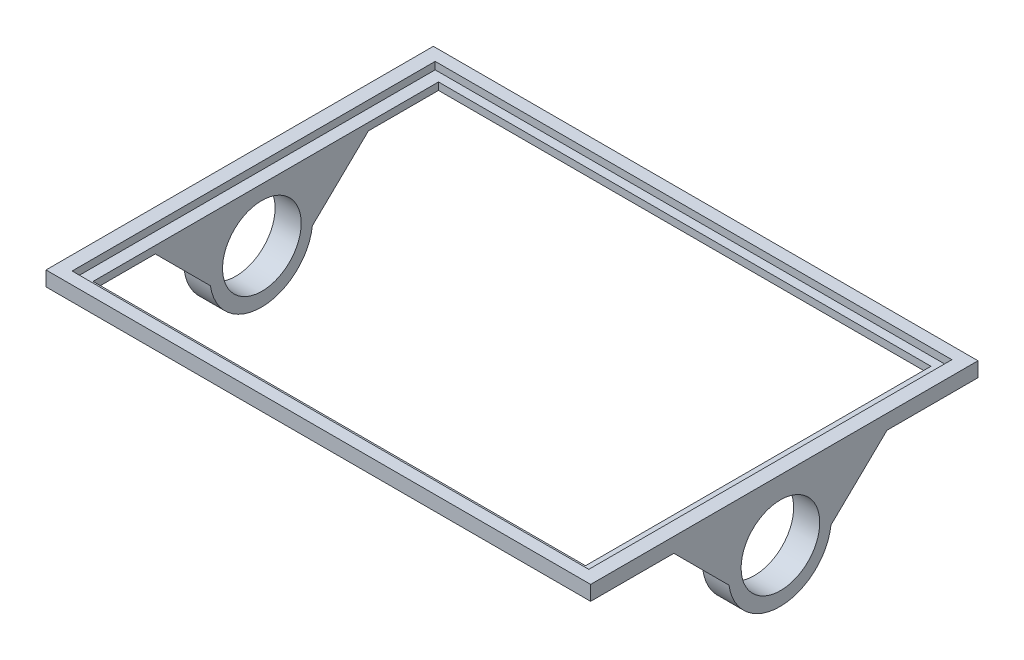
ISO-10303-21;
HEADER;
FILE_DESCRIPTION(('STEP AP214'),'2;1');
FILE_NAME('part.step','',(''),(''),'','','');
FILE_SCHEMA(('AUTOMOTIVE_DESIGN { 1 0 10303 214 1 1 1 1 }'));
ENDSEC;
DATA;
#1=APPLICATION_CONTEXT('core data for automotive mechanical design processes');
#2=APPLICATION_PROTOCOL_DEFINITION('international standard','automotive_design',2000,#1);
#3=PRODUCT_CONTEXT('',#1,'mechanical');
#4=PRODUCT('Part','Part','',(#3));
#5=PRODUCT_RELATED_PRODUCT_CATEGORY('part','',(#4));
#6=PRODUCT_DEFINITION_FORMATION('','',#4);
#7=PRODUCT_DEFINITION_CONTEXT('part definition',#1,'design');
#8=PRODUCT_DEFINITION('design','',#6,#7);
#9=PRODUCT_DEFINITION_SHAPE('','',#8);
#10=(LENGTH_UNIT() NAMED_UNIT(*) SI_UNIT(.MILLI.,.METRE.));
#11=(NAMED_UNIT(*) PLANE_ANGLE_UNIT() SI_UNIT($,.RADIAN.));
#12=(NAMED_UNIT(*) SI_UNIT($,.STERADIAN.) SOLID_ANGLE_UNIT());
#13=UNCERTAINTY_MEASURE_WITH_UNIT(LENGTH_MEASURE(1.E-05),#10,'distance_accuracy_value','');
#14=(GEOMETRIC_REPRESENTATION_CONTEXT(3) GLOBAL_UNCERTAINTY_ASSIGNED_CONTEXT((#13)) GLOBAL_UNIT_ASSIGNED_CONTEXT((#10,
#11,#12)) REPRESENTATION_CONTEXT('',''));
#15=CARTESIAN_POINT('',(0.,0.,0.));
#16=DIRECTION('',(0.,0.,1.));
#17=DIRECTION('',(1.,0.,0.));
#18=AXIS2_PLACEMENT_3D('',#15,#16,#17);
#19=CARTESIAN_POINT('',(0.,0.,0.));
#20=DIRECTION('',(0.,-1.,0.));
#21=DIRECTION('',(0.,0.,-1.));
#22=AXIS2_PLACEMENT_3D('',#19,#20,#21);
#23=PLANE('',#22);
#24=DIRECTION('',(1.,0.,0.));
#25=VECTOR('',#24,1.);
#26=CARTESIAN_POINT('',(0.,0.,23.5));
#27=LINE('',#26,#25);
#28=CARTESIAN_POINT('',(-33.5,0.,23.5));
#29=VERTEX_POINT('',#28);
#30=CARTESIAN_POINT('',(33.5,0.,23.5));
#31=VERTEX_POINT('',#30);
#32=EDGE_CURVE('E235',#29,#31,#27,.T.);
#33=ORIENTED_EDGE('',*,*,#32,.T.);
#34=DIRECTION('',(0.,0.,-1.));
#35=VECTOR('',#34,1.);
#36=CARTESIAN_POINT('',(33.5,0.,0.));
#37=LINE('',#36,#35);
#38=CARTESIAN_POINT('',(33.5,0.,15.0309445711443));
#39=VERTEX_POINT('',#38);
#40=EDGE_CURVE('E228',#31,#39,#37,.T.);
#41=ORIENTED_EDGE('',*,*,#40,.T.);
#42=DIRECTION('',(1.,0.,0.));
#43=VECTOR('',#42,1.);
#44=CARTESIAN_POINT('',(-37.05,0.,15.0309445711443));
#45=LINE('',#44,#43);
#46=CARTESIAN_POINT('',(37.05,0.,15.0309445711443));
#47=VERTEX_POINT('',#46);
#48=EDGE_CURVE('E282',#39,#47,#45,.T.);
#49=ORIENTED_EDGE('',*,*,#48,.T.);
#50=DIRECTION('',(0.,0.,-1.));
#51=VECTOR('',#50,1.);
#52=CARTESIAN_POINT('',(37.05,0.,26.35));
#53=LINE('',#52,#51);
#54=CARTESIAN_POINT('',(37.05,0.,26.35));
#55=VERTEX_POINT('',#54);
#56=EDGE_CURVE('E352',#55,#47,#53,.T.);
#57=ORIENTED_EDGE('',*,*,#56,.F.);
#58=DIRECTION('',(1.,0.,0.));
#59=VECTOR('',#58,1.);
#60=CARTESIAN_POINT('',(-37.05,0.,26.35));
#61=LINE('',#60,#59);
#62=CARTESIAN_POINT('',(-37.05,0.,26.35));
#63=VERTEX_POINT('',#62);
#64=EDGE_CURVE('E342',#63,#55,#61,.T.);
#65=ORIENTED_EDGE('',*,*,#64,.F.);
#66=DIRECTION('',(0.,0.,1.));
#67=VECTOR('',#66,1.);
#68=CARTESIAN_POINT('',(-37.05,0.,26.35));
#69=LINE('',#68,#67);
#70=CARTESIAN_POINT('',(-37.05,0.,15.0309445711443));
#71=VERTEX_POINT('',#70);
#72=EDGE_CURVE('E359',#71,#63,#69,.T.);
#73=ORIENTED_EDGE('',*,*,#72,.F.);
#74=CARTESIAN_POINT('',(-33.5,0.,15.0309445711443));
#75=VERTEX_POINT('',#74);
#76=EDGE_CURVE('E283',#71,#75,#45,.T.);
#77=ORIENTED_EDGE('',*,*,#76,.T.);
#78=DIRECTION('',(0.,0.,1.));
#79=VECTOR('',#78,1.);
#80=CARTESIAN_POINT('',(-33.5,0.,0.));
#81=LINE('',#80,#79);
#82=EDGE_CURVE('E202',#75,#29,#81,.T.);
#83=ORIENTED_EDGE('',*,*,#82,.T.);
#84=EDGE_LOOP('',(#33,#41,#49,#57,#65,#73,#77,#83));
#85=FACE_BOUND('',#84,.T.);
#86=ADVANCED_FACE('F45',(#85),#23,.T.);
#87=DIRECTION('',(1.,0.,0.));
#88=VECTOR('',#87,1.);
#89=CARTESIAN_POINT('',(-37.05,0.,-13.9690554288554));
#90=LINE('',#89,#88);
#91=CARTESIAN_POINT('',(33.5,0.,-13.9690554288554));
#92=VERTEX_POINT('',#91);
#93=CARTESIAN_POINT('',(37.05,0.,-13.9690554288554));
#94=VERTEX_POINT('',#93);
#95=EDGE_CURVE('E277',#92,#94,#90,.T.);
#96=ORIENTED_EDGE('',*,*,#95,.F.);
#97=DIRECTION('',(0.,0.,-1.));
#98=VECTOR('',#97,1.);
#99=CARTESIAN_POINT('',(33.5,0.,0.));
#100=LINE('',#99,#98);
#101=CARTESIAN_POINT('',(33.5,0.,-23.5));
#102=VERTEX_POINT('',#101);
#103=EDGE_CURVE('E220',#92,#102,#100,.T.);
#104=ORIENTED_EDGE('',*,*,#103,.T.);
#105=DIRECTION('',(-1.,0.,0.));
#106=VECTOR('',#105,1.);
#107=CARTESIAN_POINT('',(0.,0.,-23.5));
#108=LINE('',#107,#106);
#109=CARTESIAN_POINT('',(-33.5,0.,-23.5));
#110=VERTEX_POINT('',#109);
#111=EDGE_CURVE('E239',#102,#110,#108,.T.);
#112=ORIENTED_EDGE('',*,*,#111,.T.);
#113=DIRECTION('',(0.,0.,1.));
#114=VECTOR('',#113,1.);
#115=CARTESIAN_POINT('',(-33.5,0.,0.));
#116=LINE('',#115,#114);
#117=CARTESIAN_POINT('',(-33.5,0.,-13.9690554288554));
#118=VERTEX_POINT('',#117);
#119=EDGE_CURVE('E196',#110,#118,#116,.T.);
#120=ORIENTED_EDGE('',*,*,#119,.T.);
#121=CARTESIAN_POINT('',(-37.05,0.,-13.9690554288554));
#122=VERTEX_POINT('',#121);
#123=EDGE_CURVE('E278',#122,#118,#90,.T.);
#124=ORIENTED_EDGE('',*,*,#123,.F.);
#125=CARTESIAN_POINT('',(-37.05,0.,-26.35));
#126=VERTEX_POINT('',#125);
#127=EDGE_CURVE('E360',#126,#122,#69,.T.);
#128=ORIENTED_EDGE('',*,*,#127,.F.);
#129=DIRECTION('',(-1.,0.,0.));
#130=VECTOR('',#129,1.);
#131=CARTESIAN_POINT('',(-37.05,0.,-26.35));
#132=LINE('',#131,#130);
#133=CARTESIAN_POINT('',(37.05,0.,-26.35));
#134=VERTEX_POINT('',#133);
#135=EDGE_CURVE('E356',#134,#126,#132,.T.);
#136=ORIENTED_EDGE('',*,*,#135,.F.);
#137=EDGE_CURVE('E327',#94,#134,#53,.T.);
#138=ORIENTED_EDGE('',*,*,#137,.F.);
#139=EDGE_LOOP('',(#96,#104,#112,#120,#124,#128,#136,#138));
#140=FACE_BOUND('',#139,.T.);
#141=ADVANCED_FACE('F406',(#140),#23,.T.);
#142=CARTESIAN_POINT('',(0.,1.,0.));
#143=DIRECTION('',(0.,1.,0.));
#144=DIRECTION('',(0.,0.,1.));
#145=AXIS2_PLACEMENT_3D('',#142,#143,#144);
#146=PLANE('',#145);
#147=DIRECTION('',(1.,0.,0.));
#148=VECTOR('',#147,1.);
#149=CARTESIAN_POINT('',(0.,1.,24.7));
#150=LINE('',#149,#148);
#151=CARTESIAN_POINT('',(-35.15,1.,24.7));
#152=VERTEX_POINT('',#151);
#153=CARTESIAN_POINT('',(35.15,1.,24.7));
#154=VERTEX_POINT('',#153);
#155=EDGE_CURVE('E293',#152,#154,#150,.T.);
#156=ORIENTED_EDGE('',*,*,#155,.T.);
#157=DIRECTION('',(0.,0.,-1.));
#158=VECTOR('',#157,1.);
#159=CARTESIAN_POINT('',(35.15,1.,0.));
#160=LINE('',#159,#158);
#161=CARTESIAN_POINT('',(35.15,1.,-24.7));
#162=VERTEX_POINT('',#161);
#163=EDGE_CURVE('E297',#154,#162,#160,.T.);
#164=ORIENTED_EDGE('',*,*,#163,.T.);
#165=DIRECTION('',(-1.,0.,0.));
#166=VECTOR('',#165,1.);
#167=CARTESIAN_POINT('',(0.,1.,-24.7));
#168=LINE('',#167,#166);
#169=CARTESIAN_POINT('',(-35.15,1.,-24.7));
#170=VERTEX_POINT('',#169);
#171=EDGE_CURVE('E302',#162,#170,#168,.T.);
#172=ORIENTED_EDGE('',*,*,#171,.T.);
#173=DIRECTION('',(0.,0.,1.));
#174=VECTOR('',#173,1.);
#175=CARTESIAN_POINT('',(-35.15,1.,0.));
#176=LINE('',#175,#174);
#177=EDGE_CURVE('E306',#170,#152,#176,.T.);
#178=ORIENTED_EDGE('',*,*,#177,.T.);
#179=EDGE_LOOP('',(#156,#164,#172,#178));
#180=FACE_BOUND('',#179,.T.);
#181=DIRECTION('',(1.,0.,0.));
#182=VECTOR('',#181,1.);
#183=CARTESIAN_POINT('',(0.,1.,-23.5));
#184=LINE('',#183,#182);
#185=CARTESIAN_POINT('',(-33.5,1.,-23.5));
#186=VERTEX_POINT('',#185);
#187=CARTESIAN_POINT('',(33.5,1.,-23.5));
#188=VERTEX_POINT('',#187);
#189=EDGE_CURVE('E11',#186,#188,#184,.T.);
#190=ORIENTED_EDGE('',*,*,#189,.T.);
#191=DIRECTION('',(0.,0.,1.));
#192=VECTOR('',#191,1.);
#193=CARTESIAN_POINT('',(33.5,1.,0.));
#194=LINE('',#193,#192);
#195=CARTESIAN_POINT('',(33.5,1.,23.5));
#196=VERTEX_POINT('',#195);
#197=EDGE_CURVE('E232',#188,#196,#194,.T.);
#198=ORIENTED_EDGE('',*,*,#197,.T.);
#199=DIRECTION('',(-1.,0.,0.));
#200=VECTOR('',#199,1.);
#201=CARTESIAN_POINT('',(0.,1.,23.5));
#202=LINE('',#201,#200);
#203=CARTESIAN_POINT('',(-33.5,1.,23.5));
#204=VERTEX_POINT('',#203);
#205=EDGE_CURVE('E54',#196,#204,#202,.T.);
#206=ORIENTED_EDGE('',*,*,#205,.T.);
#207=DIRECTION('',(0.,0.,-1.));
#208=VECTOR('',#207,1.);
#209=CARTESIAN_POINT('',(-33.5,1.,0.));
#210=LINE('',#209,#208);
#211=EDGE_CURVE('E193',#204,#186,#210,.T.);
#212=ORIENTED_EDGE('',*,*,#211,.T.);
#213=EDGE_LOOP('',(#190,#198,#206,#212));
#214=FACE_BOUND('',#213,.T.);
#215=ADVANCED_FACE('F199',(#180,#214),#146,.T.);
#216=CARTESIAN_POINT('',(-37.05,-6.50036766395603,0.602688283106501));
#217=DIRECTION('',(1.,0.,0.));
#218=DIRECTION('',(0.,0.,-1.));
#219=AXIS2_PLACEMENT_3D('',#216,#217,#218);
#220=CYLINDRICAL_SURFACE('',#219,6.99999999999975);
#221=CARTESIAN_POINT('',(33.5,-6.50036766395603,0.602688283106501));
#222=DIRECTION('',(-1.,0.,0.));
#223=DIRECTION('',(0.,0.,1.));
#224=AXIS2_PLACEMENT_3D('',#221,#222,#223);
#225=CIRCLE('',#224,6.99999999999975);
#226=CARTESIAN_POINT('',(33.5,-7.35778064155618,-6.34460205096174));
#227=VERTEX_POINT('',#226);
#228=CARTESIAN_POINT('',(33.5,-7.50000000000003,7.53094457114404));
#229=VERTEX_POINT('',#228);
#230=EDGE_CURVE('E217',#227,#229,#225,.T.);
#231=ORIENTED_EDGE('',*,*,#230,.F.);
#232=DIRECTION('',(1.,0.,0.));
#233=VECTOR('',#232,1.);
#234=CARTESIAN_POINT('',(-37.05,-7.35778064155618,-6.34460205096174));
#235=LINE('',#234,#233);
#236=CARTESIAN_POINT('',(37.05,-7.35778064155618,-6.34460205096174));
#237=VERTEX_POINT('',#236);
#238=EDGE_CURVE('E262',#227,#237,#235,.T.);
#239=ORIENTED_EDGE('',*,*,#238,.T.);
#240=CARTESIAN_POINT('',(37.05,-6.50036766395603,0.602688283106501));
#241=DIRECTION('',(-1.,0.,0.));
#242=DIRECTION('',(0.,0.,1.));
#243=AXIS2_PLACEMENT_3D('',#240,#241,#242);
#244=CIRCLE('',#243,6.99999999999975);
#245=CARTESIAN_POINT('',(37.05,-7.50000000000004,7.53094457114415));
#246=VERTEX_POINT('',#245);
#247=EDGE_CURVE('E247',#237,#246,#244,.T.);
#248=ORIENTED_EDGE('',*,*,#247,.T.);
#249=DIRECTION('',(1.,0.,0.));
#250=VECTOR('',#249,1.);
#251=CARTESIAN_POINT('',(-37.05,-7.50000000000004,7.53094457114415));
#252=LINE('',#251,#250);
#253=EDGE_CURVE('E287',#229,#246,#252,.T.);
#254=ORIENTED_EDGE('',*,*,#253,.F.);
#255=EDGE_LOOP('',(#231,#239,#248,#254));
#256=FACE_BOUND('',#255,.T.);
#257=ADVANCED_FACE('F395',(#256),#220,.T.);
#258=CARTESIAN_POINT('',(-37.05,-7.35778064155618,-6.34460205096174));
#259=VERTEX_POINT('',#258);
#260=CARTESIAN_POINT('',(-33.5,-7.35778064155618,-6.34460205096174));
#261=VERTEX_POINT('',#260);
#262=EDGE_CURVE('E273',#259,#261,#235,.T.);
#263=ORIENTED_EDGE('',*,*,#262,.T.);
#264=CARTESIAN_POINT('',(-33.5,-6.50036766395603,0.602688283106501));
#265=DIRECTION('',(1.,0.,0.));
#266=DIRECTION('',(0.,0.,-1.));
#267=AXIS2_PLACEMENT_3D('',#264,#265,#266);
#268=CIRCLE('',#267,6.99999999999975);
#269=CARTESIAN_POINT('',(-33.5,-7.50000000000003,7.53094457114404));
#270=VERTEX_POINT('',#269);
#271=EDGE_CURVE('E69',#270,#261,#268,.T.);
#272=ORIENTED_EDGE('',*,*,#271,.F.);
#273=CARTESIAN_POINT('',(-37.05,-7.50000000000004,7.53094457114415));
#274=VERTEX_POINT('',#273);
#275=EDGE_CURVE('E288',#274,#270,#252,.T.);
#276=ORIENTED_EDGE('',*,*,#275,.F.);
#277=CARTESIAN_POINT('',(-37.05,-6.50036766395603,0.602688283106501));
#278=DIRECTION('',(-1.,0.,0.));
#279=DIRECTION('',(0.,0.,1.));
#280=AXIS2_PLACEMENT_3D('',#277,#278,#279);
#281=CIRCLE('',#280,6.99999999999975);
#282=EDGE_CURVE('E251',#259,#274,#281,.T.);
#283=ORIENTED_EDGE('',*,*,#282,.F.);
#284=EDGE_LOOP('',(#263,#272,#276,#283));
#285=FACE_BOUND('',#284,.T.);
#286=ADVANCED_FACE('F454',(#285),#220,.T.);
#287=CARTESIAN_POINT('',(-37.05,6.65952771442784,21.6904722855722));
#288=DIRECTION('',(0.,-0.707106781186552,0.707106781186543));
#289=DIRECTION('',(0.,-0.707106781186543,-0.707106781186552));
#290=AXIS2_PLACEMENT_3D('',#287,#288,#289);
#291=PLANE('',#290);
#292=ORIENTED_EDGE('',*,*,#48,.F.);
#293=DIRECTION('',(0.,-0.707106781186543,-0.707106781186552));
#294=VECTOR('',#293,1.);
#295=CARTESIAN_POINT('',(33.5,6.65952771442784,21.6904722855722));
#296=LINE('',#295,#294);
#297=EDGE_CURVE('E224',#39,#229,#296,.T.);
#298=ORIENTED_EDGE('',*,*,#297,.T.);
#299=ORIENTED_EDGE('',*,*,#253,.T.);
#300=DIRECTION('',(0.,-0.707106781186543,-0.707106781186552));
#301=VECTOR('',#300,1.);
#302=CARTESIAN_POINT('',(37.05,6.65952771442784,21.6904722855722));
#303=LINE('',#302,#301);
#304=EDGE_CURVE('E266',#47,#246,#303,.T.);
#305=ORIENTED_EDGE('',*,*,#304,.F.);
#306=EDGE_LOOP('',(#292,#298,#299,#305));
#307=FACE_BOUND('',#306,.T.);
#308=ADVANCED_FACE('F428',(#307),#291,.T.);
#309=ORIENTED_EDGE('',*,*,#275,.T.);
#310=DIRECTION('',(0.,0.707106781186543,0.707106781186552));
#311=VECTOR('',#310,1.);
#312=CARTESIAN_POINT('',(-33.5,6.65952771442784,21.6904722855722));
#313=LINE('',#312,#311);
#314=EDGE_CURVE('E210',#270,#75,#313,.T.);
#315=ORIENTED_EDGE('',*,*,#314,.T.);
#316=ORIENTED_EDGE('',*,*,#76,.F.);
#317=DIRECTION('',(0.,-0.707106781186543,-0.707106781186552));
#318=VECTOR('',#317,1.);
#319=CARTESIAN_POINT('',(-37.05,6.65952771442784,21.6904722855722));
#320=LINE('',#319,#318);
#321=EDGE_CURVE('E254',#71,#274,#320,.T.);
#322=ORIENTED_EDGE('',*,*,#321,.T.);
#323=EDGE_LOOP('',(#309,#315,#316,#322));
#324=FACE_BOUND('',#323,.T.);
#325=ADVANCED_FACE('F446',(#324),#291,.T.);
#326=CARTESIAN_POINT('',(-37.05,-19.1823453802702,5.90852792888802));
#327=DIRECTION('',(0.,-0.719578784137764,-0.694410810269265));
#328=DIRECTION('',(0.,0.694410810269265,-0.719578784137764));
#329=AXIS2_PLACEMENT_3D('',#326,#327,#328);
#330=PLANE('',#329);
#331=ORIENTED_EDGE('',*,*,#238,.F.);
#332=DIRECTION('',(0.,0.694410810269265,-0.719578784137764));
#333=VECTOR('',#332,1.);
#334=CARTESIAN_POINT('',(33.5,-19.1823453802702,5.90852792888802));
#335=LINE('',#334,#333);
#336=EDGE_CURVE('E207',#227,#92,#335,.T.);
#337=ORIENTED_EDGE('',*,*,#336,.T.);
#338=ORIENTED_EDGE('',*,*,#95,.T.);
#339=DIRECTION('',(0.,0.694410810269265,-0.719578784137764));
#340=VECTOR('',#339,1.);
#341=CARTESIAN_POINT('',(37.05,-19.1823453802702,5.90852792888802));
#342=LINE('',#341,#340);
#343=EDGE_CURVE('E255',#237,#94,#342,.T.);
#344=ORIENTED_EDGE('',*,*,#343,.F.);
#345=EDGE_LOOP('',(#331,#337,#338,#344));
#346=FACE_BOUND('',#345,.T.);
#347=ADVANCED_FACE('F403',(#346),#330,.T.);
#348=ORIENTED_EDGE('',*,*,#123,.T.);
#349=DIRECTION('',(0.,-0.694410810269265,0.719578784137764));
#350=VECTOR('',#349,1.);
#351=CARTESIAN_POINT('',(-33.5,-19.1823453802702,5.90852792888802));
#352=LINE('',#351,#350);
#353=EDGE_CURVE('E384',#118,#261,#352,.T.);
#354=ORIENTED_EDGE('',*,*,#353,.T.);
#355=ORIENTED_EDGE('',*,*,#262,.F.);
#356=DIRECTION('',(0.,0.694410810269265,-0.719578784137764));
#357=VECTOR('',#356,1.);
#358=CARTESIAN_POINT('',(-37.05,-19.1823453802702,5.90852792888802));
#359=LINE('',#358,#357);
#360=EDGE_CURVE('E259',#259,#122,#359,.T.);
#361=ORIENTED_EDGE('',*,*,#360,.T.);
#362=EDGE_LOOP('',(#348,#354,#355,#361));
#363=FACE_BOUND('',#362,.T.);
#364=ADVANCED_FACE('F456',(#363),#330,.T.);
#365=CARTESIAN_POINT('',(-37.05,-6.3,0.530944571144332));
#366=DIRECTION('',(1.,0.,0.));
#367=DIRECTION('',(0.,0.,-1.));
#368=AXIS2_PLACEMENT_3D('',#365,#366,#367);
#369=CYLINDRICAL_SURFACE('',#368,5.34999999999989);
#370=CARTESIAN_POINT('',(37.05,-6.3,0.530944571144332));
#371=DIRECTION('',(-1.,0.,0.));
#372=DIRECTION('',(0.,0.,1.));
#373=AXIS2_PLACEMENT_3D('',#370,#371,#372);
#374=CIRCLE('',#373,5.34999999999989);
#375=CARTESIAN_POINT('',(37.05,-6.3,5.88094457114422));
#376=VERTEX_POINT('',#375);
#377=EDGE_CURVE('E242',#376,#376,#374,.T.);
#378=ORIENTED_EDGE('',*,*,#377,.F.);
#379=EDGE_LOOP('',(#378));
#380=FACE_BOUND('',#379,.T.);
#381=CARTESIAN_POINT('',(33.5,-6.3,0.530944571144332));
#382=DIRECTION('',(-1.,0.,0.));
#383=DIRECTION('',(0.,0.,1.));
#384=AXIS2_PLACEMENT_3D('',#381,#382,#383);
#385=CIRCLE('',#384,5.34999999999989);
#386=CARTESIAN_POINT('',(33.5,-6.3,5.88094457114422));
#387=VERTEX_POINT('',#386);
#388=EDGE_CURVE('E201',#387,#387,#385,.T.);
#389=ORIENTED_EDGE('',*,*,#388,.T.);
#390=EDGE_LOOP('',(#389));
#391=FACE_BOUND('',#390,.T.);
#392=ADVANCED_FACE('F459',(#380,#391),#369,.F.);
#393=CARTESIAN_POINT('',(-37.05,-6.3,0.530944571144332));
#394=DIRECTION('',(-1.,0.,0.));
#395=DIRECTION('',(0.,0.,1.));
#396=AXIS2_PLACEMENT_3D('',#393,#394,#395);
#397=CIRCLE('',#396,5.34999999999989);
#398=CARTESIAN_POINT('',(-37.05,-6.3,5.88094457114422));
#399=VERTEX_POINT('',#398);
#400=EDGE_CURVE('E243',#399,#399,#397,.T.);
#401=ORIENTED_EDGE('',*,*,#400,.T.);
#402=EDGE_LOOP('',(#401));
#403=FACE_BOUND('',#402,.T.);
#404=CARTESIAN_POINT('',(-33.5,-6.3,0.530944571144332));
#405=DIRECTION('',(1.,0.,0.));
#406=DIRECTION('',(0.,0.,-1.));
#407=AXIS2_PLACEMENT_3D('',#404,#405,#406);
#408=CIRCLE('',#407,5.34999999999989);
#409=CARTESIAN_POINT('',(-33.5,-6.3,-4.81905542885556));
#410=VERTEX_POINT('',#409);
#411=EDGE_CURVE('E381',#410,#410,#408,.T.);
#412=ORIENTED_EDGE('',*,*,#411,.T.);
#413=EDGE_LOOP('',(#412));
#414=FACE_BOUND('',#413,.T.);
#415=ADVANCED_FACE('F465',(#403,#414),#369,.F.);
#416=CARTESIAN_POINT('',(37.05,2.,26.35));
#417=DIRECTION('',(-1.,0.,0.));
#418=DIRECTION('',(0.,0.,1.));
#419=AXIS2_PLACEMENT_3D('',#416,#417,#418);
#420=PLANE('',#419);
#421=ORIENTED_EDGE('',*,*,#377,.T.);
#422=EDGE_LOOP('',(#421));
#423=FACE_BOUND('',#422,.T.);
#424=ORIENTED_EDGE('',*,*,#56,.T.);
#425=ORIENTED_EDGE('',*,*,#304,.T.);
#426=ORIENTED_EDGE('',*,*,#247,.F.);
#427=ORIENTED_EDGE('',*,*,#343,.T.);
#428=ORIENTED_EDGE('',*,*,#137,.T.);
#429=DIRECTION('',(0.,-1.,0.));
#430=VECTOR('',#429,1.);
#431=CARTESIAN_POINT('',(37.05,2.,-26.35));
#432=LINE('',#431,#430);
#433=CARTESIAN_POINT('',(37.05,2.,-26.35));
#434=VERTEX_POINT('',#433);
#435=EDGE_CURVE('E377',#434,#134,#432,.T.);
#436=ORIENTED_EDGE('',*,*,#435,.F.);
#437=DIRECTION('',(0.,0.,-1.));
#438=VECTOR('',#437,1.);
#439=CARTESIAN_POINT('',(37.05,2.,26.35));
#440=LINE('',#439,#438);
#441=CARTESIAN_POINT('',(37.05,2.,26.35));
#442=VERTEX_POINT('',#441);
#443=EDGE_CURVE('E337',#442,#434,#440,.T.);
#444=ORIENTED_EDGE('',*,*,#443,.F.);
#445=DIRECTION('',(0.,-1.,0.));
#446=VECTOR('',#445,1.);
#447=CARTESIAN_POINT('',(37.05,2.,26.35));
#448=LINE('',#447,#446);
#449=EDGE_CURVE('E351',#442,#55,#448,.T.);
#450=ORIENTED_EDGE('',*,*,#449,.T.);
#451=EDGE_LOOP('',(#424,#425,#426,#427,#428,#436,#444,#450));
#452=FACE_BOUND('',#451,.T.);
#453=ADVANCED_FACE('F47',(#423,#452),#420,.F.);
#454=CARTESIAN_POINT('',(-37.05,2.,-26.35));
#455=DIRECTION('',(0.,0.,1.));
#456=DIRECTION('',(1.,0.,0.));
#457=AXIS2_PLACEMENT_3D('',#454,#455,#456);
#458=PLANE('',#457);
#459=ORIENTED_EDGE('',*,*,#135,.T.);
#460=DIRECTION('',(0.,-1.,0.));
#461=VECTOR('',#460,1.);
#462=CARTESIAN_POINT('',(-37.05,2.,-26.35));
#463=LINE('',#462,#461);
#464=CARTESIAN_POINT('',(-37.05,2.,-26.35));
#465=VERTEX_POINT('',#464);
#466=EDGE_CURVE('E373',#465,#126,#463,.T.);
#467=ORIENTED_EDGE('',*,*,#466,.F.);
#468=DIRECTION('',(-1.,0.,0.));
#469=VECTOR('',#468,1.);
#470=CARTESIAN_POINT('',(-37.05,2.,-26.35));
#471=LINE('',#470,#469);
#472=EDGE_CURVE('E341',#434,#465,#471,.T.);
#473=ORIENTED_EDGE('',*,*,#472,.F.);
#474=ORIENTED_EDGE('',*,*,#435,.T.);
#475=EDGE_LOOP('',(#459,#467,#473,#474));
#476=FACE_BOUND('',#475,.T.);
#477=ADVANCED_FACE('F412',(#476),#458,.F.);
#478=CARTESIAN_POINT('',(-37.05,2.,26.35));
#479=DIRECTION('',(1.,0.,0.));
#480=DIRECTION('',(0.,0.,-1.));
#481=AXIS2_PLACEMENT_3D('',#478,#479,#480);
#482=PLANE('',#481);
#483=ORIENTED_EDGE('',*,*,#400,.F.);
#484=EDGE_LOOP('',(#483));
#485=FACE_BOUND('',#484,.T.);
#486=ORIENTED_EDGE('',*,*,#127,.T.);
#487=ORIENTED_EDGE('',*,*,#360,.F.);
#488=ORIENTED_EDGE('',*,*,#282,.T.);
#489=ORIENTED_EDGE('',*,*,#321,.F.);
#490=ORIENTED_EDGE('',*,*,#72,.T.);
#491=DIRECTION('',(0.,-1.,0.));
#492=VECTOR('',#491,1.);
#493=CARTESIAN_POINT('',(-37.05,2.,26.35));
#494=LINE('',#493,#492);
#495=CARTESIAN_POINT('',(-37.05,2.,26.35));
#496=VERTEX_POINT('',#495);
#497=EDGE_CURVE('E369',#496,#63,#494,.T.);
#498=ORIENTED_EDGE('',*,*,#497,.F.);
#499=DIRECTION('',(0.,0.,1.));
#500=VECTOR('',#499,1.);
#501=CARTESIAN_POINT('',(-37.05,2.,26.35));
#502=LINE('',#501,#500);
#503=EDGE_CURVE('E345',#465,#496,#502,.T.);
#504=ORIENTED_EDGE('',*,*,#503,.F.);
#505=ORIENTED_EDGE('',*,*,#466,.T.);
#506=EDGE_LOOP('',(#486,#487,#488,#489,#490,#498,#504,#505));
#507=FACE_BOUND('',#506,.T.);
#508=ADVANCED_FACE('F450',(#485,#507),#482,.F.);
#509=CARTESIAN_POINT('',(-37.05,2.,26.35));
#510=DIRECTION('',(0.,0.,-1.));
#511=DIRECTION('',(-1.,0.,0.));
#512=AXIS2_PLACEMENT_3D('',#509,#510,#511);
#513=PLANE('',#512);
#514=ORIENTED_EDGE('',*,*,#64,.T.);
#515=ORIENTED_EDGE('',*,*,#449,.F.);
#516=DIRECTION('',(1.,0.,0.));
#517=VECTOR('',#516,1.);
#518=CARTESIAN_POINT('',(-37.05,2.,26.35));
#519=LINE('',#518,#517);
#520=EDGE_CURVE('E348',#496,#442,#519,.T.);
#521=ORIENTED_EDGE('',*,*,#520,.F.);
#522=ORIENTED_EDGE('',*,*,#497,.T.);
#523=EDGE_LOOP('',(#514,#515,#521,#522));
#524=FACE_BOUND('',#523,.T.);
#525=ADVANCED_FACE('F421',(#524),#513,.F.);
#526=CARTESIAN_POINT('',(0.,2.,0.));
#527=DIRECTION('',(0.,-1.,0.));
#528=DIRECTION('',(0.,0.,-1.));
#529=AXIS2_PLACEMENT_3D('',#526,#527,#528);
#530=PLANE('',#529);
#531=DIRECTION('',(0.,0.,-1.));
#532=VECTOR('',#531,1.);
#533=CARTESIAN_POINT('',(35.15,2.,0.));
#534=LINE('',#533,#532);
#535=CARTESIAN_POINT('',(35.15,2.,24.7));
#536=VERTEX_POINT('',#535);
#537=CARTESIAN_POINT('',(35.15,2.,-24.7));
#538=VERTEX_POINT('',#537);
#539=EDGE_CURVE('E313',#536,#538,#534,.T.);
#540=ORIENTED_EDGE('',*,*,#539,.F.);
#541=DIRECTION('',(1.,0.,0.));
#542=VECTOR('',#541,1.);
#543=CARTESIAN_POINT('',(0.,2.,24.7));
#544=LINE('',#543,#542);
#545=CARTESIAN_POINT('',(-35.15,2.,24.7));
#546=VERTEX_POINT('',#545);
#547=EDGE_CURVE('E292',#546,#536,#544,.T.);
#548=ORIENTED_EDGE('',*,*,#547,.F.);
#549=DIRECTION('',(0.,0.,1.));
#550=VECTOR('',#549,1.);
#551=CARTESIAN_POINT('',(-35.15,2.,0.));
#552=LINE('',#551,#550);
#553=CARTESIAN_POINT('',(-35.15,2.,-24.7));
#554=VERTEX_POINT('',#553);
#555=EDGE_CURVE('E298',#554,#546,#552,.T.);
#556=ORIENTED_EDGE('',*,*,#555,.F.);
#557=DIRECTION('',(-1.,0.,0.));
#558=VECTOR('',#557,1.);
#559=CARTESIAN_POINT('',(0.,2.,-24.7));
#560=LINE('',#559,#558);
#561=EDGE_CURVE('E317',#538,#554,#560,.T.);
#562=ORIENTED_EDGE('',*,*,#561,.F.);
#563=EDGE_LOOP('',(#540,#548,#556,#562));
#564=FACE_BOUND('',#563,.T.);
#565=ORIENTED_EDGE('',*,*,#443,.T.);
#566=ORIENTED_EDGE('',*,*,#472,.T.);
#567=ORIENTED_EDGE('',*,*,#503,.T.);
#568=ORIENTED_EDGE('',*,*,#520,.T.);
#569=EDGE_LOOP('',(#565,#566,#567,#568));
#570=FACE_BOUND('',#569,.T.);
#571=ADVANCED_FACE('F416',(#564,#570),#530,.F.);
#572=CARTESIAN_POINT('',(0.,1.,24.7));
#573=DIRECTION('',(0.,0.,1.));
#574=DIRECTION('',(1.,0.,0.));
#575=AXIS2_PLACEMENT_3D('',#572,#573,#574);
#576=PLANE('',#575);
#577=ORIENTED_EDGE('',*,*,#547,.T.);
#578=DIRECTION('',(0.,1.,0.));
#579=VECTOR('',#578,1.);
#580=CARTESIAN_POINT('',(35.15,1.,24.7));
#581=LINE('',#580,#579);
#582=EDGE_CURVE('E310',#154,#536,#581,.T.);
#583=ORIENTED_EDGE('',*,*,#582,.F.);
#584=ORIENTED_EDGE('',*,*,#155,.F.);
#585=DIRECTION('',(0.,1.,0.));
#586=VECTOR('',#585,1.);
#587=CARTESIAN_POINT('',(-35.15,1.,24.7));
#588=LINE('',#587,#586);
#589=EDGE_CURVE('E324',#152,#546,#588,.T.);
#590=ORIENTED_EDGE('',*,*,#589,.T.);
#591=EDGE_LOOP('',(#577,#583,#584,#590));
#592=FACE_BOUND('',#591,.T.);
#593=ADVANCED_FACE('F629',(#592),#576,.F.);
#594=CARTESIAN_POINT('',(-35.15,1.,0.));
#595=DIRECTION('',(-1.,0.,0.));
#596=DIRECTION('',(0.,0.,1.));
#597=AXIS2_PLACEMENT_3D('',#594,#595,#596);
#598=PLANE('',#597);
#599=ORIENTED_EDGE('',*,*,#555,.T.);
#600=ORIENTED_EDGE('',*,*,#589,.F.);
#601=ORIENTED_EDGE('',*,*,#177,.F.);
#602=DIRECTION('',(0.,1.,0.));
#603=VECTOR('',#602,1.);
#604=CARTESIAN_POINT('',(-35.15,1.,-24.7));
#605=LINE('',#604,#603);
#606=EDGE_CURVE('E328',#170,#554,#605,.T.);
#607=ORIENTED_EDGE('',*,*,#606,.T.);
#608=EDGE_LOOP('',(#599,#600,#601,#607));
#609=FACE_BOUND('',#608,.T.);
#610=ADVANCED_FACE('F619',(#609),#598,.F.);
#611=CARTESIAN_POINT('',(0.,1.,-24.7));
#612=DIRECTION('',(0.,0.,-1.));
#613=DIRECTION('',(-1.,0.,0.));
#614=AXIS2_PLACEMENT_3D('',#611,#612,#613);
#615=PLANE('',#614);
#616=ORIENTED_EDGE('',*,*,#561,.T.);
#617=ORIENTED_EDGE('',*,*,#606,.F.);
#618=ORIENTED_EDGE('',*,*,#171,.F.);
#619=DIRECTION('',(0.,1.,0.));
#620=VECTOR('',#619,1.);
#621=CARTESIAN_POINT('',(35.15,1.,-24.7));
#622=LINE('',#621,#620);
#623=EDGE_CURVE('E331',#162,#538,#622,.T.);
#624=ORIENTED_EDGE('',*,*,#623,.T.);
#625=EDGE_LOOP('',(#616,#617,#618,#624));
#626=FACE_BOUND('',#625,.T.);
#627=ADVANCED_FACE('F501',(#626),#615,.F.);
#628=CARTESIAN_POINT('',(35.15,1.,0.));
#629=DIRECTION('',(1.,0.,0.));
#630=DIRECTION('',(0.,0.,-1.));
#631=AXIS2_PLACEMENT_3D('',#628,#629,#630);
#632=PLANE('',#631);
#633=ORIENTED_EDGE('',*,*,#539,.T.);
#634=ORIENTED_EDGE('',*,*,#623,.F.);
#635=ORIENTED_EDGE('',*,*,#163,.F.);
#636=ORIENTED_EDGE('',*,*,#582,.T.);
#637=EDGE_LOOP('',(#633,#634,#635,#636));
#638=FACE_BOUND('',#637,.T.);
#639=ADVANCED_FACE('F495',(#638),#632,.F.);
#640=CARTESIAN_POINT('',(33.5,2.,23.5));
#641=DIRECTION('',(-1.,0.,0.));
#642=DIRECTION('',(0.,0.,1.));
#643=AXIS2_PLACEMENT_3D('',#640,#641,#642);
#644=PLANE('',#643);
#645=DIRECTION('',(0.,-1.,0.));
#646=VECTOR('',#645,1.);
#647=CARTESIAN_POINT('',(33.5,2.,-23.5));
#648=LINE('',#647,#646);
#649=EDGE_CURVE('E188',#188,#102,#648,.T.);
#650=ORIENTED_EDGE('',*,*,#649,.T.);
#651=ORIENTED_EDGE('',*,*,#103,.F.);
#652=ORIENTED_EDGE('',*,*,#336,.F.);
#653=ORIENTED_EDGE('',*,*,#230,.T.);
#654=ORIENTED_EDGE('',*,*,#297,.F.);
#655=ORIENTED_EDGE('',*,*,#40,.F.);
#656=DIRECTION('',(0.,-1.,0.));
#657=VECTOR('',#656,1.);
#658=CARTESIAN_POINT('',(33.5,2.,23.5));
#659=LINE('',#658,#657);
#660=EDGE_CURVE('E682',#196,#31,#659,.T.);
#661=ORIENTED_EDGE('',*,*,#660,.F.);
#662=ORIENTED_EDGE('',*,*,#197,.F.);
#663=EDGE_LOOP('',(#650,#651,#652,#653,#654,#655,#661,#662));
#664=FACE_BOUND('',#663,.T.);
#665=ORIENTED_EDGE('',*,*,#388,.F.);
#666=EDGE_LOOP('',(#665));
#667=FACE_BOUND('',#666,.T.);
#668=ADVANCED_FACE('F430',(#664,#667),#644,.T.);
#669=CARTESIAN_POINT('',(-33.5,2.,-23.5));
#670=DIRECTION('',(0.,0.,1.));
#671=DIRECTION('',(1.,0.,0.));
#672=AXIS2_PLACEMENT_3D('',#669,#670,#671);
#673=PLANE('',#672);
#674=ORIENTED_EDGE('',*,*,#649,.F.);
#675=ORIENTED_EDGE('',*,*,#189,.F.);
#676=DIRECTION('',(0.,-1.,0.));
#677=VECTOR('',#676,1.);
#678=CARTESIAN_POINT('',(-33.5,2.,-23.5));
#679=LINE('',#678,#677);
#680=EDGE_CURVE('E185',#186,#110,#679,.T.);
#681=ORIENTED_EDGE('',*,*,#680,.T.);
#682=ORIENTED_EDGE('',*,*,#111,.F.);
#683=EDGE_LOOP('',(#674,#675,#681,#682));
#684=FACE_BOUND('',#683,.T.);
#685=ADVANCED_FACE('F184',(#684),#673,.T.);
#686=CARTESIAN_POINT('',(-33.5,2.,23.5));
#687=DIRECTION('',(1.,0.,0.));
#688=DIRECTION('',(0.,0.,-1.));
#689=AXIS2_PLACEMENT_3D('',#686,#687,#688);
#690=PLANE('',#689);
#691=ORIENTED_EDGE('',*,*,#411,.F.);
#692=EDGE_LOOP('',(#691));
#693=FACE_BOUND('',#692,.T.);
#694=DIRECTION('',(0.,-1.,0.));
#695=VECTOR('',#694,1.);
#696=CARTESIAN_POINT('',(-33.5,2.,23.5));
#697=LINE('',#696,#695);
#698=EDGE_CURVE('E61',#204,#29,#697,.T.);
#699=ORIENTED_EDGE('',*,*,#698,.T.);
#700=ORIENTED_EDGE('',*,*,#82,.F.);
#701=ORIENTED_EDGE('',*,*,#314,.F.);
#702=ORIENTED_EDGE('',*,*,#271,.T.);
#703=ORIENTED_EDGE('',*,*,#353,.F.);
#704=ORIENTED_EDGE('',*,*,#119,.F.);
#705=ORIENTED_EDGE('',*,*,#680,.F.);
#706=ORIENTED_EDGE('',*,*,#211,.F.);
#707=EDGE_LOOP('',(#699,#700,#701,#702,#703,#704,#705,#706));
#708=FACE_BOUND('',#707,.T.);
#709=ADVANCED_FACE('F192',(#693,#708),#690,.T.);
#710=CARTESIAN_POINT('',(-33.5,2.,23.5));
#711=DIRECTION('',(0.,0.,-1.));
#712=DIRECTION('',(-1.,0.,0.));
#713=AXIS2_PLACEMENT_3D('',#710,#711,#712);
#714=PLANE('',#713);
#715=ORIENTED_EDGE('',*,*,#698,.F.);
#716=ORIENTED_EDGE('',*,*,#205,.F.);
#717=ORIENTED_EDGE('',*,*,#660,.T.);
#718=ORIENTED_EDGE('',*,*,#32,.F.);
#719=EDGE_LOOP('',(#715,#716,#717,#718));
#720=FACE_BOUND('',#719,.T.);
#721=ADVANCED_FACE('F507',(#720),#714,.T.);
#722=CLOSED_SHELL('',(#86,#141,#215,#257,#286,#308,#325,#347,#364,#392,#415,#453,#477,#508,#525,
#571,#593,#610,#627,#639,#668,#685,#709,#721));
#723=MANIFOLD_SOLID_BREP('B2',#722);
#724=ADVANCED_BREP_SHAPE_REPRESENTATION('',(#18,#723),#14);
#725=SHAPE_DEFINITION_REPRESENTATION(#9,#724);
ENDSEC;
END-ISO-10303-21;
